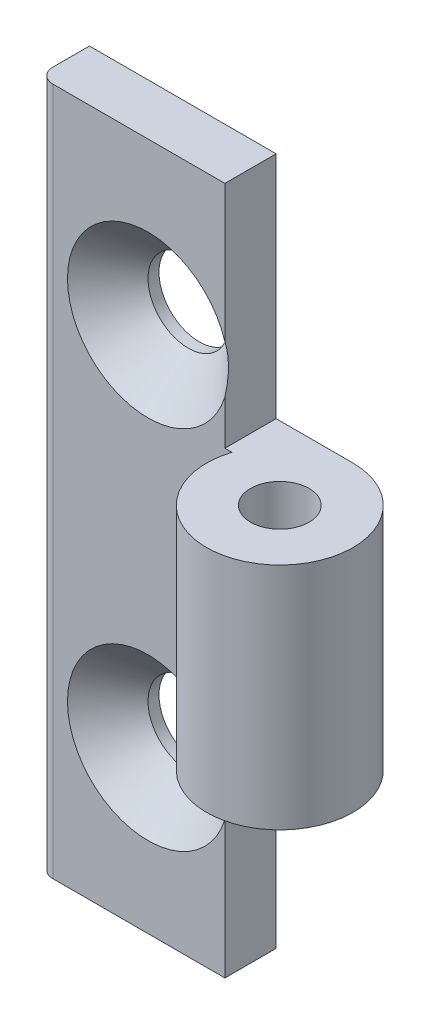
ISO-10303-21;
HEADER;
FILE_DESCRIPTION(('STEP AP214'),'2;1');
FILE_NAME('part.step','',(''),(''),'','','');
FILE_SCHEMA(('AUTOMOTIVE_DESIGN { 1 0 10303 214 1 1 1 1 }'));
ENDSEC;
DATA;
#1=APPLICATION_CONTEXT('core data for automotive mechanical design processes');
#2=APPLICATION_PROTOCOL_DEFINITION('international standard','automotive_design',2000,#1);
#3=PRODUCT_CONTEXT('',#1,'mechanical');
#4=PRODUCT('Part','Part','',(#3));
#5=PRODUCT_RELATED_PRODUCT_CATEGORY('part','',(#4));
#6=PRODUCT_DEFINITION_FORMATION('','',#4);
#7=PRODUCT_DEFINITION_CONTEXT('part definition',#1,'design');
#8=PRODUCT_DEFINITION('design','',#6,#7);
#9=PRODUCT_DEFINITION_SHAPE('','',#8);
#10=(LENGTH_UNIT() NAMED_UNIT(*) SI_UNIT(.MILLI.,.METRE.));
#11=(NAMED_UNIT(*) PLANE_ANGLE_UNIT() SI_UNIT($,.RADIAN.));
#12=(NAMED_UNIT(*) SI_UNIT($,.STERADIAN.) SOLID_ANGLE_UNIT());
#13=UNCERTAINTY_MEASURE_WITH_UNIT(LENGTH_MEASURE(1.E-05),#10,'distance_accuracy_value','');
#14=(GEOMETRIC_REPRESENTATION_CONTEXT(3) GLOBAL_UNCERTAINTY_ASSIGNED_CONTEXT((#13)) GLOBAL_UNIT_ASSIGNED_CONTEXT((#10,
#11,#12)) REPRESENTATION_CONTEXT('',''));
#15=CARTESIAN_POINT('',(0.,0.,0.));
#16=DIRECTION('',(0.,0.,1.));
#17=DIRECTION('',(1.,0.,0.));
#18=AXIS2_PLACEMENT_3D('',#15,#16,#17);
#19=CARTESIAN_POINT('',(0.,23.5,0.));
#20=DIRECTION('',(0.,-1.,0.));
#21=DIRECTION('',(0.,0.,-1.));
#22=AXIS2_PLACEMENT_3D('',#19,#20,#21);
#23=PLANE('',#22);
#24=CARTESIAN_POINT('',(-17.0000000000007,23.5,-2.49999999999931));
#25=DIRECTION('',(0.,-1.,0.));
#26=DIRECTION('',(0.,0.,-1.));
#27=AXIS2_PLACEMENT_3D('',#24,#25,#26);
#28=CIRCLE('',#27,0.999999999999304);
#29=CARTESIAN_POINT('',(-17.,23.5,-1.5));
#30=VERTEX_POINT('',#29);
#31=CARTESIAN_POINT('',(-18.,23.5,-2.5));
#32=VERTEX_POINT('',#31);
#33=EDGE_CURVE('E52',#30,#32,#28,.T.);
#34=ORIENTED_EDGE('',*,*,#33,.F.);
#35=DIRECTION('',(-1.,0.,0.));
#36=VECTOR('',#35,1.);
#37=CARTESIAN_POINT('',(0.,23.5,-1.5));
#38=LINE('',#37,#36);
#39=CARTESIAN_POINT('',(-5.25,23.5,-1.5));
#40=VERTEX_POINT('',#39);
#41=EDGE_CURVE('E134',#40,#30,#38,.T.);
#42=ORIENTED_EDGE('',*,*,#41,.F.);
#43=DIRECTION('',(0.,0.,-1.));
#44=VECTOR('',#43,1.);
#45=CARTESIAN_POINT('',(-5.25,23.5,47.));
#46=LINE('',#45,#44);
#47=CARTESIAN_POINT('',(-5.25,23.5,-5.));
#48=VERTEX_POINT('',#47);
#49=EDGE_CURVE('E249',#40,#48,#46,.T.);
#50=ORIENTED_EDGE('',*,*,#49,.T.);
#51=DIRECTION('',(-1.,0.,0.));
#52=VECTOR('',#51,1.);
#53=CARTESIAN_POINT('',(0.,23.5,-5.));
#54=LINE('',#53,#52);
#55=CARTESIAN_POINT('',(-18.,23.5,-5.));
#56=VERTEX_POINT('',#55);
#57=EDGE_CURVE('E140',#48,#56,#54,.T.);
#58=ORIENTED_EDGE('',*,*,#57,.T.);
#59=DIRECTION('',(0.,0.,-1.));
#60=VECTOR('',#59,1.);
#61=CARTESIAN_POINT('',(-18.,23.5,-1.5));
#62=LINE('',#61,#60);
#63=EDGE_CURVE('E142',#32,#56,#62,.T.);
#64=ORIENTED_EDGE('',*,*,#63,.F.);
#65=EDGE_LOOP('',(#34,#42,#50,#58,#64));
#66=FACE_BOUND('',#65,.T.);
#67=ADVANCED_FACE('F33',(#66),#23,.F.);
#68=CARTESIAN_POINT('',(5.,-23.5,0.));
#69=DIRECTION('',(0.,1.,0.));
#70=DIRECTION('',(0.,0.,1.));
#71=AXIS2_PLACEMENT_3D('',#68,#69,#70);
#72=PLANE('',#71);
#73=CARTESIAN_POINT('',(-17.0000000000007,-23.5,-2.49999999999931));
#74=DIRECTION('',(0.,-1.,0.));
#75=DIRECTION('',(0.,0.,-1.));
#76=AXIS2_PLACEMENT_3D('',#73,#74,#75);
#77=CIRCLE('',#76,0.999999999999304);
#78=CARTESIAN_POINT('',(-17.,-23.5,-1.5));
#79=VERTEX_POINT('',#78);
#80=CARTESIAN_POINT('',(-18.,-23.5,-2.5));
#81=VERTEX_POINT('',#80);
#82=EDGE_CURVE('E117',#79,#81,#77,.T.);
#83=ORIENTED_EDGE('',*,*,#82,.T.);
#84=DIRECTION('',(0.,0.,-1.));
#85=VECTOR('',#84,1.);
#86=CARTESIAN_POINT('',(-18.,-23.5,-1.5));
#87=LINE('',#86,#85);
#88=CARTESIAN_POINT('',(-18.,-23.5,-5.));
#89=VERTEX_POINT('',#88);
#90=EDGE_CURVE('E159',#81,#89,#87,.T.);
#91=ORIENTED_EDGE('',*,*,#90,.T.);
#92=DIRECTION('',(1.,0.,0.));
#93=VECTOR('',#92,1.);
#94=CARTESIAN_POINT('',(-18.,-23.5,-5.));
#95=LINE('',#94,#93);
#96=CARTESIAN_POINT('',(-5.25,-23.5,-5.));
#97=VERTEX_POINT('',#96);
#98=EDGE_CURVE('E154',#89,#97,#95,.T.);
#99=ORIENTED_EDGE('',*,*,#98,.T.);
#100=DIRECTION('',(0.,0.,-1.));
#101=VECTOR('',#100,1.);
#102=CARTESIAN_POINT('',(-5.25,-23.5,47.));
#103=LINE('',#102,#101);
#104=CARTESIAN_POINT('',(-5.25,-23.5,-1.5));
#105=VERTEX_POINT('',#104);
#106=EDGE_CURVE('E139',#105,#97,#103,.T.);
#107=ORIENTED_EDGE('',*,*,#106,.F.);
#108=DIRECTION('',(1.,0.,0.));
#109=VECTOR('',#108,1.);
#110=CARTESIAN_POINT('',(-18.,-23.5,-1.5));
#111=LINE('',#110,#109);
#112=EDGE_CURVE('E130',#79,#105,#111,.T.);
#113=ORIENTED_EDGE('',*,*,#112,.F.);
#114=EDGE_LOOP('',(#83,#91,#99,#107,#113));
#115=FACE_BOUND('',#114,.T.);
#116=ADVANCED_FACE('F137',(#115),#72,.F.);
#117=CARTESIAN_POINT('',(0.,0.,-1.5));
#118=DIRECTION('',(0.,0.,1.));
#119=DIRECTION('',(1.,0.,0.));
#120=AXIS2_PLACEMENT_3D('',#117,#118,#119);
#121=PLANE('',#120);
#122=ORIENTED_EDGE('',*,*,#41,.T.);
#123=DIRECTION('',(0.,-1.,0.));
#124=VECTOR('',#123,1.);
#125=CARTESIAN_POINT('',(-17.,23.5,-1.5));
#126=LINE('',#125,#124);
#127=EDGE_CURVE('E120',#30,#79,#126,.T.);
#128=ORIENTED_EDGE('',*,*,#127,.T.);
#129=ORIENTED_EDGE('',*,*,#112,.T.);
#130=DIRECTION('',(0.,-1.,0.));
#131=VECTOR('',#130,1.);
#132=CARTESIAN_POINT('',(-5.25,0.,-1.5));
#133=LINE('',#132,#131);
#134=CARTESIAN_POINT('',(-5.25,-14.1393596310755,-1.5));
#135=VERTEX_POINT('',#134);
#136=EDGE_CURVE('E267',#135,#105,#133,.T.);
#137=ORIENTED_EDGE('',*,*,#136,.F.);
#138=CARTESIAN_POINT('',(-10.5,-12.5,-1.5));
#139=DIRECTION('',(0.,0.,-1.));
#140=DIRECTION('',(-1.,0.,0.));
#141=AXIS2_PLACEMENT_3D('',#138,#139,#140);
#142=CIRCLE('',#141,5.5);
#143=CARTESIAN_POINT('',(-5.25,-10.8606403689245,-1.5));
#144=VERTEX_POINT('',#143);
#145=EDGE_CURVE('E239',#135,#144,#142,.T.);
#146=ORIENTED_EDGE('',*,*,#145,.T.);
#147=CARTESIAN_POINT('',(-5.25,-7.8333333333333,-1.5));
#148=VERTEX_POINT('',#147);
#149=EDGE_CURVE('E148',#148,#144,#133,.T.);
#150=ORIENTED_EDGE('',*,*,#149,.F.);
#151=DIRECTION('',(-1.,0.,0.));
#152=VECTOR('',#151,1.);
#153=CARTESIAN_POINT('',(0.,-7.8333333333333,-1.5));
#154=LINE('',#153,#152);
#155=CARTESIAN_POINT('',(-4.76969600708473,-7.8333333333333,-1.5));
#156=VERTEX_POINT('',#155);
#157=EDGE_CURVE('E266',#156,#148,#154,.T.);
#158=ORIENTED_EDGE('',*,*,#157,.F.);
#159=DIRECTION('',(0.,1.,0.));
#160=VECTOR('',#159,1.);
#161=CARTESIAN_POINT('',(-4.76969600708473,-23.5,-1.5));
#162=LINE('',#161,#160);
#163=CARTESIAN_POINT('',(-4.76969600708473,7.8333333333333,-1.5));
#164=VERTEX_POINT('',#163);
#165=EDGE_CURVE('E161',#164,#156,#162,.F.);
#166=ORIENTED_EDGE('',*,*,#165,.F.);
#167=DIRECTION('',(1.,0.,0.));
#168=VECTOR('',#167,1.);
#169=CARTESIAN_POINT('',(0.,7.8333333333333,-1.5));
#170=LINE('',#169,#168);
#171=CARTESIAN_POINT('',(-5.25,7.8333333333333,-1.5));
#172=VERTEX_POINT('',#171);
#173=EDGE_CURVE('E262',#172,#164,#170,.T.);
#174=ORIENTED_EDGE('',*,*,#173,.F.);
#175=DIRECTION('',(0.,-1.,0.));
#176=VECTOR('',#175,1.);
#177=CARTESIAN_POINT('',(-5.25,0.,-1.5));
#178=LINE('',#177,#176);
#179=CARTESIAN_POINT('',(-5.25,10.8606403689245,-1.5));
#180=VERTEX_POINT('',#179);
#181=EDGE_CURVE('E256',#180,#172,#178,.T.);
#182=ORIENTED_EDGE('',*,*,#181,.F.);
#183=CARTESIAN_POINT('',(-10.5,12.5,-1.5));
#184=DIRECTION('',(0.,0.,-1.));
#185=DIRECTION('',(-1.,0.,0.));
#186=AXIS2_PLACEMENT_3D('',#183,#184,#185);
#187=CIRCLE('',#186,5.5);
#188=CARTESIAN_POINT('',(-5.25,14.1393596310755,-1.5));
#189=VERTEX_POINT('',#188);
#190=EDGE_CURVE('E58',#180,#189,#187,.T.);
#191=ORIENTED_EDGE('',*,*,#190,.T.);
#192=EDGE_CURVE('E257',#40,#189,#178,.T.);
#193=ORIENTED_EDGE('',*,*,#192,.F.);
#194=EDGE_LOOP('',(#122,#128,#129,#137,#146,#150,#158,#166,#174,#182,#191,#193));
#195=FACE_BOUND('',#194,.T.);
#196=ADVANCED_FACE('F128',(#195),#121,.T.);
#197=CARTESIAN_POINT('',(-18.,23.5,-1.5));
#198=DIRECTION('',(1.,0.,0.));
#199=DIRECTION('',(0.,0.,-1.));
#200=AXIS2_PLACEMENT_3D('',#197,#198,#199);
#201=PLANE('',#200);
#202=DIRECTION('',(0.,-1.,0.));
#203=VECTOR('',#202,1.);
#204=CARTESIAN_POINT('',(-18.,23.5,-2.5));
#205=LINE('',#204,#203);
#206=EDGE_CURVE('E121',#32,#81,#205,.T.);
#207=ORIENTED_EDGE('',*,*,#206,.F.);
#208=ORIENTED_EDGE('',*,*,#63,.T.);
#209=DIRECTION('',(0.,-1.,0.));
#210=VECTOR('',#209,1.);
#211=CARTESIAN_POINT('',(-18.,23.5,-5.));
#212=LINE('',#211,#210);
#213=EDGE_CURVE('E151',#56,#89,#212,.T.);
#214=ORIENTED_EDGE('',*,*,#213,.T.);
#215=ORIENTED_EDGE('',*,*,#90,.F.);
#216=EDGE_LOOP('',(#207,#208,#214,#215));
#217=FACE_BOUND('',#216,.T.);
#218=ADVANCED_FACE('F209',(#217),#201,.F.);
#219=CARTESIAN_POINT('',(-5.25,7.8333333333333,47.));
#220=DIRECTION('',(-1.,0.,0.));
#221=DIRECTION('',(0.,0.,1.));
#222=AXIS2_PLACEMENT_3D('',#219,#220,#221);
#223=PLANE('',#222);
#224=CARTESIAN_POINT('',(-5.25,1.96620570453176,4.76959312207688));
#225=CARTESIAN_POINT('',(-5.25,2.17789575709252,4.58014854863097));
#226=CARTESIAN_POINT('',(-5.25,2.39013508266683,4.39131375979838));
#227=CARTESIAN_POINT('',(-5.25,2.81595003155766,4.01513768812596));
#228=CARTESIAN_POINT('',(-5.25,3.02952571599067,3.82779647449701));
#229=CARTESIAN_POINT('',(-5.25,3.45858131899658,3.45459486651712));
#230=CARTESIAN_POINT('',(-5.25,3.67406377545094,3.26873738612356));
#231=CARTESIAN_POINT('',(-5.25,4.10688472778992,2.89920089340847));
#232=CARTESIAN_POINT('',(-5.25,4.32422319348273,2.71552184576592));
#233=CARTESIAN_POINT('',(-5.25,4.76923849679367,2.3440673477564));
#234=CARTESIAN_POINT('',(-5.25,4.99699970912213,2.15639279130553));
#235=CARTESIAN_POINT('',(-5.25,5.45544950022572,1.7846560633459));
#236=CARTESIAN_POINT('',(-5.25,5.68613801140881,1.60059380867722));
#237=CARTESIAN_POINT('',(-5.25,6.1509780017392,1.23720637031563));
#238=CARTESIAN_POINT('',(-5.25,6.38512704848103,1.05787808510293));
#239=CARTESIAN_POINT('',(-5.25,6.85790780293076,0.705250712790699));
#240=CARTESIAN_POINT('',(-5.25,7.09653907927989,0.531951050043126));
#241=CARTESIAN_POINT('',(-5.25,7.58062314874416,0.192551610200415));
#242=CARTESIAN_POINT('',(-5.25,7.82610332043215,0.026490646830292));
#243=CARTESIAN_POINT('',(-5.25,8.32440406810655,-0.294647382925031));
#244=CARTESIAN_POINT('',(-5.25,8.5772283873505,-0.44971870439318));
#245=CARTESIAN_POINT('',(-5.25,9.08959522887237,-0.743038287158069));
#246=CARTESIAN_POINT('',(-5.25,9.34905909165822,-0.88142253292033));
#247=CARTESIAN_POINT('',(-5.25,9.87841128399093,-1.13641998213882));
#248=CARTESIAN_POINT('',(-5.25,10.1482860258345,-1.25306047658699));
#249=CARTESIAN_POINT('',(-5.25,10.5291281452276,-1.39310419344067));
#250=CARTESIAN_POINT('',(-5.25,10.6353055224393,-1.42960265943194));
#251=CARTESIAN_POINT('',(-5.25,10.8492565825674,-1.49753395320315));
#252=CARTESIAN_POINT('',(-5.25,10.9570302094983,-1.52896695818745));
#253=CARTESIAN_POINT('',(-5.25,11.2827306764191,-1.6147850213403));
#254=CARTESIAN_POINT('',(-5.25,11.5030328211093,-1.66068750629753));
#255=CARTESIAN_POINT('',(-5.25,11.8553645226943,-1.71214567567516));
#256=CARTESIAN_POINT('',(-5.25,11.9861522961667,-1.72653811787084));
#257=CARTESIAN_POINT('',(-5.25,12.248456971617,-1.74560250939123));
#258=CARTESIAN_POINT('',(-5.25,12.3799738643842,-1.75027458123124));
#259=CARTESIAN_POINT('',(-5.25,12.6428127837559,-1.74970069437844));
#260=CARTESIAN_POINT('',(-5.25,12.7741348419126,-1.74446758814681));
#261=CARTESIAN_POINT('',(-5.25,13.0360362643994,-1.72432273692963));
#262=CARTESIAN_POINT('',(-5.25,13.1666155317276,-1.70940975583893));
#263=CARTESIAN_POINT('',(-5.25,13.4880704237974,-1.66118269237422));
#264=CARTESIAN_POINT('',(-5.25,13.6781491880637,-1.62249444652424));
#265=CARTESIAN_POINT('',(-5.25,14.0540045718539,-1.52786666411824));
#266=CARTESIAN_POINT('',(-5.25,14.2397781681888,-1.47191537747716));
#267=CARTESIAN_POINT('',(-5.25,14.5158903644421,-1.37694825665352));
#268=CARTESIAN_POINT('',(-5.25,14.6080905731277,-1.34319772624565));
#269=CARTESIAN_POINT('',(-5.25,14.7911885454548,-1.2724420914636));
#270=CARTESIAN_POINT('',(-5.25,14.8820868892192,-1.23543849270507));
#271=CARTESIAN_POINT('',(-5.25,15.0626190202741,-1.15852357302256));
#272=CARTESIAN_POINT('',(-5.25,15.1522530429236,-1.11861280204142));
#273=CARTESIAN_POINT('',(-5.25,15.3303269744517,-1.03619054925571));
#274=CARTESIAN_POINT('',(-5.25,15.4187667326326,-0.993678742915533));
#275=CARTESIAN_POINT('',(-5.25,15.6569744419579,-0.875299949092434));
#276=CARTESIAN_POINT('',(-5.25,15.8056387148912,-0.797207983332616));
#277=CARTESIAN_POINT('',(-5.25,16.0999407992361,-0.635492051003212));
#278=CARTESIAN_POINT('',(-5.25,16.2455780151388,-0.551867009205114));
#279=CARTESIAN_POINT('',(-5.25,16.5342319097201,-0.380025153128538));
#280=CARTESIAN_POINT('',(-5.25,16.6772469003954,-0.291805512422881));
#281=CARTESIAN_POINT('',(-5.25,16.9608892510794,-0.11159946622438));
#282=CARTESIAN_POINT('',(-5.25,17.1015164232778,-0.0196127663628434));
#283=CARTESIAN_POINT('',(-5.25,17.5214120667191,0.261792066141473));
#284=CARTESIAN_POINT('',(-5.25,17.7975127388819,0.455937253399674));
#285=CARTESIAN_POINT('',(-5.25,18.3431157983201,0.853001446314746));
#286=CARTESIAN_POINT('',(-5.25,18.6126204306579,1.05591739978734));
#287=CARTESIAN_POINT('',(-5.25,19.1249670633103,1.45153362750591));
#288=CARTESIAN_POINT('',(-5.25,19.3682000190748,1.64372937671005));
#289=CARTESIAN_POINT('',(-5.25,19.851291097354,2.03235411497323));
#290=CARTESIAN_POINT('',(-5.25,20.0911488748326,2.22878353170724));
#291=CARTESIAN_POINT('',(-5.25,20.5658606167883,2.62305843405526));
#292=CARTESIAN_POINT('',(-5.25,20.8007404616427,2.82087283826274));
#293=CARTESIAN_POINT('',(-5.25,21.2682251547819,3.21907693847443));
#294=CARTESIAN_POINT('',(-5.25,21.5008304625402,3.41946609460877));
#295=CARTESIAN_POINT('',(-5.25,21.7325548409188,3.62085537471317));
#296=B_SPLINE_CURVE_WITH_KNOTS('',3,(#224,#225,#226,#227,#228,#229,#230,#231,#232,#233,#234,
#235,#236,#237,#238,#239,#240,#241,#242,#243,#244,#245,#246,#247,#248,#249,#250,#251,#252,#253,
#254,#255,#256,#257,#258,#259,#260,#261,#262,#263,#264,#265,#266,#267,#268,#269,#270,#271,#272,
#273,#274,#275,#276,#277,#278,#279,#280,#281,#282,#283,#284,#285,#286,#287,#288,#289,#290,#291,
#292,#293,#294,#295),.UNSPECIFIED.,.F.,.F.,(4,2,2,2,2,2,2,2,2,2,2,2,2,2,2,2,2,2,2,2,2,2,2,2,2,2,
2,2,2,2,2,2,2,2,2,4),(0.,0.852245300289658,1.70452986592093,2.5582046638551,3.41186560136745,
4.29720208563532,5.18251816433036,6.06723904881684,6.95187522180661,7.84078372762304,
8.73015354063419,9.61170003799586,10.4921325284726,10.8288455957403,11.1655468812608,
11.8389631295675,12.2333868317742,12.6278055626448,13.0217128664047,13.4156704814209,
13.9966075832166,14.5779409753054,14.8724402859559,15.1668040041266,15.4611121821052,
15.7554571565992,16.2590808068384,16.7628026140554,17.2668380390615,17.7709129262641,
18.7832066996735,19.7951509920857,20.7250981703801,21.6551397341398,22.5763638012946,
23.4973977615846),.UNSPECIFIED.);
#297=EDGE_CURVE('E11',#180,#189,#296,.T.);
#298=ORIENTED_EDGE('',*,*,#297,.F.);
#299=ORIENTED_EDGE('',*,*,#181,.T.);
#300=DIRECTION('',(0.,0.,-1.));
#301=VECTOR('',#300,1.);
#302=CARTESIAN_POINT('',(-5.25,7.8333333333333,47.));
#303=LINE('',#302,#301);
#304=CARTESIAN_POINT('',(-5.25,7.8333333333333,-5.));
#305=VERTEX_POINT('',#304);
#306=EDGE_CURVE('E251',#172,#305,#303,.T.);
#307=ORIENTED_EDGE('',*,*,#306,.T.);
#308=DIRECTION('',(0.,-1.,0.));
#309=VECTOR('',#308,1.);
#310=CARTESIAN_POINT('',(-5.25,0.,-5.));
#311=LINE('',#310,#309);
#312=EDGE_CURVE('E164',#48,#305,#311,.T.);
#313=ORIENTED_EDGE('',*,*,#312,.F.);
#314=ORIENTED_EDGE('',*,*,#49,.F.);
#315=ORIENTED_EDGE('',*,*,#192,.T.);
#316=EDGE_LOOP('',(#298,#299,#307,#313,#314,#315));
#317=FACE_BOUND('',#316,.T.);
#318=ADVANCED_FACE('F205',(#317),#223,.F.);
#319=CARTESIAN_POINT('',(-5.25,-23.5,47.));
#320=DIRECTION('',(-1.,0.,0.));
#321=DIRECTION('',(0.,0.,1.));
#322=AXIS2_PLACEMENT_3D('',#319,#320,#321);
#323=PLANE('',#322);
#324=CARTESIAN_POINT('',(-5.25,-26.6003505571546,8.04600896698692));
#325=CARTESIAN_POINT('',(-5.25,-26.2776648085903,7.74363522228391));
#326=CARTESIAN_POINT('',(-5.25,-25.9543760333835,7.44190112679981));
#327=CARTESIAN_POINT('',(-5.25,-25.3062442856165,6.84007510363304));
#328=CARTESIAN_POINT('',(-5.25,-24.981401236746,6.53998325816311));
#329=CARTESIAN_POINT('',(-5.25,-24.3290085549213,5.94106702983706));
#330=CARTESIAN_POINT('',(-5.25,-24.0014541149649,5.64224787733475));
#331=CARTESIAN_POINT('',(-5.25,-23.3440030064451,5.04721250482845));
#332=CARTESIAN_POINT('',(-5.25,-23.0141064029779,4.75099621299057));
#333=CARTESIAN_POINT('',(-5.25,-22.3175857857699,4.13191138221224));
#334=CARTESIAN_POINT('',(-5.25,-21.9506430464078,3.80940087226669));
#335=CARTESIAN_POINT('',(-5.25,-21.2119337622045,3.16985546104611));
#336=CARTESIAN_POINT('',(-5.25,-20.8401667728391,2.85282107072594));
#337=CARTESIAN_POINT('',(-5.25,-20.2778680945298,2.38334730243548));
#338=CARTESIAN_POINT('',(-5.25,-20.0897884556362,2.22797139643917));
#339=CARTESIAN_POINT('',(-5.25,-19.7116976837063,1.91959020102894));
#340=CARTESIAN_POINT('',(-5.25,-19.5216865856777,1.76658486877479));
#341=CARTESIAN_POINT('',(-5.25,-19.1394011943411,1.46348533805961));
#342=CARTESIAN_POINT('',(-5.25,-18.9471272613402,1.31339068594978));
#343=CARTESIAN_POINT('',(-5.25,-18.5598462151183,1.01677727218896));
#344=CARTESIAN_POINT('',(-5.25,-18.3648392296139,0.870258344314297));
#345=CARTESIAN_POINT('',(-5.25,-18.005953626149,0.606962908761055));
#346=CARTESIAN_POINT('',(-5.25,-17.8426016540454,0.489469792530127));
#347=CARTESIAN_POINT('',(-5.25,-17.5132682084315,0.258209367499158));
#348=CARTESIAN_POINT('',(-5.25,-17.3472866765122,0.14444214163275));
#349=CARTESIAN_POINT('',(-5.25,-17.0119715101354,-0.0786782537960856));
#350=CARTESIAN_POINT('',(-5.25,-16.8426327726815,-0.188023789567103));
#351=CARTESIAN_POINT('',(-5.25,-16.5003671379625,-0.400949124177243));
#352=CARTESIAN_POINT('',(-5.25,-16.3274403782963,-0.504529143562064));
#353=CARTESIAN_POINT('',(-5.25,-15.9811439048985,-0.702293218462214));
#354=CARTESIAN_POINT('',(-5.25,-15.8078633323571,-0.796631207701722));
#355=CARTESIAN_POINT('',(-5.25,-15.4568179862008,-0.976503617572549));
#356=CARTESIAN_POINT('',(-5.25,-15.2790522782892,-1.06203618478084));
#357=CARTESIAN_POINT('',(-5.25,-14.7392208755938,-1.30149220508657));
#358=CARTESIAN_POINT('',(-5.25,-14.3692297912383,-1.43910953227761));
#359=CARTESIAN_POINT('',(-5.25,-13.8597949348459,-1.57820816482983));
#360=CARTESIAN_POINT('',(-5.25,-13.7284013393436,-1.60976102753559));
#361=CARTESIAN_POINT('',(-5.25,-13.4637258245985,-1.66384994805054));
#362=CARTESIAN_POINT('',(-5.25,-13.3304437616567,-1.68638531583503));
#363=CARTESIAN_POINT('',(-5.25,-13.0628199298205,-1.72158071391647));
#364=CARTESIAN_POINT('',(-5.25,-12.9284805579778,-1.73425881296761));
#365=CARTESIAN_POINT('',(-5.25,-12.6592180337848,-1.74930692277106));
#366=CARTESIAN_POINT('',(-5.25,-12.5242948624115,-1.75167659505415));
#367=CARTESIAN_POINT('',(-5.25,-12.2314809296486,-1.74550870205161));
#368=CARTESIAN_POINT('',(-5.25,-12.0736282152239,-1.73502653590481));
#369=CARTESIAN_POINT('',(-5.25,-11.7594450567878,-1.7003287479165));
#370=CARTESIAN_POINT('',(-5.25,-11.6031148628184,-1.67611090771464));
#371=CARTESIAN_POINT('',(-5.25,-11.292366667522,-1.61506107260624));
#372=CARTESIAN_POINT('',(-5.25,-11.1379579245366,-1.57818256249691));
#373=CARTESIAN_POINT('',(-5.25,-10.832225074166,-1.49342363712409));
#374=CARTESIAN_POINT('',(-5.25,-10.6809010757812,-1.44554283382248));
#375=CARTESIAN_POINT('',(-5.25,-10.359046393724,-1.33253363490235));
#376=CARTESIAN_POINT('',(-5.25,-10.1890501341022,-1.26589425807713));
#377=CARTESIAN_POINT('',(-5.25,-9.85331795346919,-1.12255484792298));
#378=CARTESIAN_POINT('',(-5.25,-9.68758393214744,-1.04585041843245));
#379=CARTESIAN_POINT('',(-5.25,-9.35985848493816,-0.884230703569723));
#380=CARTESIAN_POINT('',(-5.25,-9.19787370343333,-0.799302045932223));
#381=CARTESIAN_POINT('',(-5.25,-8.87753480931902,-0.622941108605644));
#382=CARTESIAN_POINT('',(-5.25,-8.71918022728835,-0.531509676135073));
#383=CARTESIAN_POINT('',(-5.25,-8.40338702758905,-0.342030653883525));
#384=CARTESIAN_POINT('',(-5.25,-8.24599439295884,-0.243906782129586));
#385=CARTESIAN_POINT('',(-5.25,-7.93404274553729,-0.0432618226003899));
#386=CARTESIAN_POINT('',(-5.25,-7.7794838069841,0.059259380143335));
#387=CARTESIAN_POINT('',(-5.25,-7.47297751067142,0.267795807347991));
#388=CARTESIAN_POINT('',(-5.25,-7.3210276665822,0.37380738812394));
#389=CARTESIAN_POINT('',(-5.25,-7.01925649753526,0.588797387929581));
#390=CARTESIAN_POINT('',(-5.25,-6.86943508444105,0.697775683562009));
#391=CARTESIAN_POINT('',(-5.25,-6.5404934622026,0.941256011053461));
#392=CARTESIAN_POINT('',(-5.25,-6.36179733401846,1.07633031139282));
#393=CARTESIAN_POINT('',(-5.25,-6.00667117421934,1.34942957450511));
#394=CARTESIAN_POINT('',(-5.25,-5.83024122122249,1.48745463920572));
#395=CARTESIAN_POINT('',(-5.25,-5.3037750997341,1.90518380488842));
#396=CARTESIAN_POINT('',(-5.25,-4.95661030947537,2.18850616488069));
#397=CARTESIAN_POINT('',(-5.25,-4.26771793848706,2.76200357521821));
#398=CARTESIAN_POINT('',(-5.25,-3.92599329497658,3.05218213043985));
#399=CARTESIAN_POINT('',(-5.25,-3.24676165433352,3.6374448862089));
#400=CARTESIAN_POINT('',(-5.25,-2.90925478076536,3.93252922988963));
#401=CARTESIAN_POINT('',(-5.25,-2.23668935242119,4.52706859409326));
#402=CARTESIAN_POINT('',(-5.25,-1.90163852647138,4.82653233807233));
#403=CARTESIAN_POINT('',(-5.25,-1.23408490649624,5.42829377550018));
#404=CARTESIAN_POINT('',(-5.25,-0.901582154159578,5.73059151513642));
#405=CARTESIAN_POINT('',(-5.25,-0.238718987208984,6.33730501712813));
#406=CARTESIAN_POINT('',(-5.25,0.0916421000755467,6.64172004531475));
#407=CARTESIAN_POINT('',(-5.25,0.750720440733688,7.25232415215834));
#408=CARTESIAN_POINT('',(-5.25,1.07943769115545,7.55851323399884));
#409=CARTESIAN_POINT('',(-5.25,1.9816839949167,8.40260882622122));
#410=CARTESIAN_POINT('',(-5.25,2.5538311819439,8.94199205906421));
#411=CARTESIAN_POINT('',(-5.25,3.69521057757047,10.0239390046083));
#412=CARTESIAN_POINT('',(-5.25,4.26444249874157,10.5665030200211));
#413=CARTESIAN_POINT('',(-5.25,5.39826451507161,11.651631361637));
#414=CARTESIAN_POINT('',(-5.25,5.96286405364642,12.1941858277097));
#415=CARTESIAN_POINT('',(-5.25,7.09028073762804,13.2810194068588));
#416=CARTESIAN_POINT('',(-5.25,7.6530980733399,13.8252983224649));
#417=CARTESIAN_POINT('',(-5.25,8.21529610047225,14.3702127394708));
#418=B_SPLINE_CURVE_WITH_KNOTS('',3,(#324,#325,#326,#327,#328,#329,#330,#331,#332,#333,#334,
#335,#336,#337,#338,#339,#340,#341,#342,#343,#344,#345,#346,#347,#348,#349,#350,#351,#352,#353,
#354,#355,#356,#357,#358,#359,#360,#361,#362,#363,#364,#365,#366,#367,#368,#369,#370,#371,#372,
#373,#374,#375,#376,#377,#378,#379,#380,#381,#382,#383,#384,#385,#386,#387,#388,#389,#390,#391,
#392,#393,#394,#395,#396,#397,#398,#399,#400,#401,#402,#403,#404,#405,#406,#407,#408,#409,#410,
#411,#412,#413,#414,#415,#416,#417),.UNSPECIFIED.,.F.,.F.,(4,2,2,2,2,2,2,2,2,2,2,2,2,2,2,2,2,2,
2,2,2,2,2,2,2,2,2,2,2,2,2,2,2,2,2,2,2,2,2,2,2,2,2,2,2,2,4),(0.,1.32665444243336,
2.65337470192894,3.98350033358125,5.31358914032394,6.77913894789077,8.24482476932668,
8.97668467463452,9.70853133854583,10.4402630073848,11.1719605953761,11.7755712790736,
12.3791953892665,12.9838206287376,13.5884227238352,14.1800502763959,14.7718021050844,
15.9504570331893,16.3555966216295,16.7607672056938,17.1651933339042,17.5696327410326,
18.0435823032895,18.5176084318968,18.993395104532,19.4691985601879,20.0165653232128,
20.5641719630369,21.112684437234,21.6611255785553,22.2174599396817,22.7738088550782,
23.3295943337727,23.8853567303922,24.5573264788459,25.2293194766475,26.5734840229253,
27.9183512425603,29.2632577697,30.6113618746794,31.9594879889152,33.3071678831243,
34.6548501964977,37.0137677366885,39.3729135399549,41.7220029687451,44.070832476652),.UNSPECIFIED.);
#419=EDGE_CURVE('E45',#135,#144,#418,.T.);
#420=ORIENTED_EDGE('',*,*,#419,.F.);
#421=ORIENTED_EDGE('',*,*,#136,.T.);
#422=ORIENTED_EDGE('',*,*,#106,.T.);
#423=DIRECTION('',(0.,-1.,0.));
#424=VECTOR('',#423,1.);
#425=CARTESIAN_POINT('',(-5.25,0.,-5.));
#426=LINE('',#425,#424);
#427=CARTESIAN_POINT('',(-5.25,-7.8333333333333,-5.));
#428=VERTEX_POINT('',#427);
#429=EDGE_CURVE('E173',#428,#97,#426,.T.);
#430=ORIENTED_EDGE('',*,*,#429,.F.);
#431=DIRECTION('',(0.,0.,-1.));
#432=VECTOR('',#431,1.);
#433=CARTESIAN_POINT('',(-5.25,-7.8333333333333,47.));
#434=LINE('',#433,#432);
#435=EDGE_CURVE('E253',#148,#428,#434,.T.);
#436=ORIENTED_EDGE('',*,*,#435,.F.);
#437=ORIENTED_EDGE('',*,*,#149,.T.);
#438=EDGE_LOOP('',(#420,#421,#422,#430,#436,#437));
#439=FACE_BOUND('',#438,.T.);
#440=ADVANCED_FACE('F185',(#439),#323,.F.);
#441=CARTESIAN_POINT('',(0.,-23.5,0.));
#442=DIRECTION('',(0.,1.,0.));
#443=DIRECTION('',(0.,0.,1.));
#444=AXIS2_PLACEMENT_3D('',#441,#442,#443);
#445=CYLINDRICAL_SURFACE('',#444,5.);
#446=ORIENTED_EDGE('',*,*,#165,.T.);
#447=CARTESIAN_POINT('',(0.,-7.8333333333333,0.));
#448=DIRECTION('',(0.,1.,0.));
#449=DIRECTION('',(0.,0.,1.));
#450=AXIS2_PLACEMENT_3D('',#447,#448,#449);
#451=CIRCLE('',#450,5.);
#452=CARTESIAN_POINT('',(0.,-7.8333333333333,-5.));
#453=VERTEX_POINT('',#452);
#454=EDGE_CURVE('E265',#156,#453,#451,.T.);
#455=ORIENTED_EDGE('',*,*,#454,.T.);
#456=DIRECTION('',(0.,1.,0.));
#457=VECTOR('',#456,1.);
#458=CARTESIAN_POINT('',(0.,-23.5,-5.));
#459=LINE('',#458,#457);
#460=CARTESIAN_POINT('',(0.,7.8333333333333,-5.));
#461=VERTEX_POINT('',#460);
#462=EDGE_CURVE('E145',#453,#461,#459,.T.);
#463=ORIENTED_EDGE('',*,*,#462,.T.);
#464=CARTESIAN_POINT('',(0.,7.8333333333333,0.));
#465=DIRECTION('',(0.,-1.,0.));
#466=DIRECTION('',(0.,0.,-1.));
#467=AXIS2_PLACEMENT_3D('',#464,#465,#466);
#468=CIRCLE('',#467,5.);
#469=EDGE_CURVE('E260',#461,#164,#468,.T.);
#470=ORIENTED_EDGE('',*,*,#469,.T.);
#471=EDGE_LOOP('',(#446,#455,#463,#470));
#472=FACE_BOUND('',#471,.T.);
#473=ADVANCED_FACE('F279',(#472),#445,.T.);
#474=CARTESIAN_POINT('',(0.,0.,-5.));
#475=DIRECTION('',(0.,0.,1.));
#476=DIRECTION('',(1.,0.,0.));
#477=AXIS2_PLACEMENT_3D('',#474,#475,#476);
#478=PLANE('',#477);
#479=CARTESIAN_POINT('',(-10.5,12.5,-5.));
#480=DIRECTION('',(0.,0.,-1.));
#481=DIRECTION('',(-1.,0.,0.));
#482=AXIS2_PLACEMENT_3D('',#479,#480,#481);
#483=CIRCLE('',#482,2.75);
#484=CARTESIAN_POINT('',(-13.25,12.5,-5.));
#485=VERTEX_POINT('',#484);
#486=EDGE_CURVE('E236',#485,#485,#483,.T.);
#487=ORIENTED_EDGE('',*,*,#486,.F.);
#488=EDGE_LOOP('',(#487));
#489=FACE_BOUND('',#488,.T.);
#490=CARTESIAN_POINT('',(-10.5,-12.5,-5.));
#491=DIRECTION('',(0.,0.,-1.));
#492=DIRECTION('',(-1.,0.,0.));
#493=AXIS2_PLACEMENT_3D('',#490,#491,#492);
#494=CIRCLE('',#493,2.75);
#495=CARTESIAN_POINT('',(-13.25,-12.5,-5.));
#496=VERTEX_POINT('',#495);
#497=EDGE_CURVE('E179',#496,#496,#494,.T.);
#498=ORIENTED_EDGE('',*,*,#497,.F.);
#499=EDGE_LOOP('',(#498));
#500=FACE_BOUND('',#499,.T.);
#501=DIRECTION('',(-1.,0.,0.));
#502=VECTOR('',#501,1.);
#503=CARTESIAN_POINT('',(0.,-7.8333333333333,-5.));
#504=LINE('',#503,#502);
#505=EDGE_CURVE('E170',#453,#428,#504,.T.);
#506=ORIENTED_EDGE('',*,*,#505,.T.);
#507=ORIENTED_EDGE('',*,*,#429,.T.);
#508=ORIENTED_EDGE('',*,*,#98,.F.);
#509=ORIENTED_EDGE('',*,*,#213,.F.);
#510=ORIENTED_EDGE('',*,*,#57,.F.);
#511=ORIENTED_EDGE('',*,*,#312,.T.);
#512=DIRECTION('',(1.,0.,0.));
#513=VECTOR('',#512,1.);
#514=CARTESIAN_POINT('',(0.,7.8333333333333,-5.));
#515=LINE('',#514,#513);
#516=EDGE_CURVE('E167',#305,#461,#515,.T.);
#517=ORIENTED_EDGE('',*,*,#516,.T.);
#518=ORIENTED_EDGE('',*,*,#462,.F.);
#519=EDGE_LOOP('',(#506,#507,#508,#509,#510,#511,#517,#518));
#520=FACE_BOUND('',#519,.T.);
#521=ADVANCED_FACE('F213',(#489,#500,#520),#478,.F.);
#522=CARTESIAN_POINT('',(5.,7.8333333333333,47.));
#523=DIRECTION('',(0.,-1.,0.));
#524=DIRECTION('',(0.,0.,-1.));
#525=AXIS2_PLACEMENT_3D('',#522,#523,#524);
#526=PLANE('',#525);
#527=CARTESIAN_POINT('',(0.,7.8333333333333,0.));
#528=DIRECTION('',(0.,-1.,0.));
#529=DIRECTION('',(0.,0.,-1.));
#530=AXIS2_PLACEMENT_3D('',#527,#528,#529);
#531=CIRCLE('',#530,2.);
#532=CARTESIAN_POINT('',(0.,7.8333333333333,-2.));
#533=VERTEX_POINT('',#532);
#534=EDGE_CURVE('E178',#533,#533,#531,.F.);
#535=ORIENTED_EDGE('',*,*,#534,.F.);
#536=EDGE_LOOP('',(#535));
#537=FACE_BOUND('',#536,.T.);
#538=ORIENTED_EDGE('',*,*,#173,.T.);
#539=ORIENTED_EDGE('',*,*,#469,.F.);
#540=ORIENTED_EDGE('',*,*,#516,.F.);
#541=ORIENTED_EDGE('',*,*,#306,.F.);
#542=EDGE_LOOP('',(#538,#539,#540,#541));
#543=FACE_BOUND('',#542,.T.);
#544=ADVANCED_FACE('F211',(#537,#543),#526,.F.);
#545=CARTESIAN_POINT('',(-5.25,-7.8333333333333,47.));
#546=DIRECTION('',(0.,1.,0.));
#547=DIRECTION('',(0.,0.,1.));
#548=AXIS2_PLACEMENT_3D('',#545,#546,#547);
#549=PLANE('',#548);
#550=CARTESIAN_POINT('',(0.,-7.8333333333333,0.));
#551=DIRECTION('',(0.,1.,0.));
#552=DIRECTION('',(0.,0.,1.));
#553=AXIS2_PLACEMENT_3D('',#550,#551,#552);
#554=CIRCLE('',#553,2.);
#555=CARTESIAN_POINT('',(0.,-7.8333333333333,2.));
#556=VERTEX_POINT('',#555);
#557=EDGE_CURVE('E176',#556,#556,#554,.F.);
#558=ORIENTED_EDGE('',*,*,#557,.F.);
#559=EDGE_LOOP('',(#558));
#560=FACE_BOUND('',#559,.T.);
#561=ORIENTED_EDGE('',*,*,#157,.T.);
#562=ORIENTED_EDGE('',*,*,#435,.T.);
#563=ORIENTED_EDGE('',*,*,#505,.F.);
#564=ORIENTED_EDGE('',*,*,#454,.F.);
#565=EDGE_LOOP('',(#561,#562,#563,#564));
#566=FACE_BOUND('',#565,.T.);
#567=ADVANCED_FACE('F203',(#560,#566),#549,.F.);
#568=CARTESIAN_POINT('',(0.,-26.7,0.));
#569=DIRECTION('',(0.,1.,0.));
#570=DIRECTION('',(0.,0.,1.));
#571=AXIS2_PLACEMENT_3D('',#568,#569,#570);
#572=CYLINDRICAL_SURFACE('',#571,2.);
#573=ORIENTED_EDGE('',*,*,#557,.T.);
#574=EDGE_LOOP('',(#573));
#575=FACE_BOUND('',#574,.T.);
#576=ORIENTED_EDGE('',*,*,#534,.T.);
#577=EDGE_LOOP('',(#576));
#578=FACE_BOUND('',#577,.T.);
#579=ADVANCED_FACE('F195',(#575,#578),#572,.F.);
#580=CARTESIAN_POINT('',(-10.5,-12.5,-1.5));
#581=DIRECTION('',(0.,0.,1.));
#582=DIRECTION('',(1.,0.,0.));
#583=AXIS2_PLACEMENT_3D('',#580,#581,#582);
#584=CONICAL_SURFACE('',#583,5.5,0.785398163397448);
#585=CARTESIAN_POINT('',(-10.5,-12.5,-4.25));
#586=DIRECTION('',(0.,0.,-1.));
#587=DIRECTION('',(-1.,0.,0.));
#588=AXIS2_PLACEMENT_3D('',#585,#586,#587);
#589=CIRCLE('',#588,2.75);
#590=CARTESIAN_POINT('',(-13.25,-12.5,-4.25));
#591=VERTEX_POINT('',#590);
#592=EDGE_CURVE('E242',#591,#591,#589,.T.);
#593=ORIENTED_EDGE('',*,*,#592,.T.);
#594=EDGE_LOOP('',(#593));
#595=FACE_BOUND('',#594,.T.);
#596=ORIENTED_EDGE('',*,*,#419,.T.);
#597=ORIENTED_EDGE('',*,*,#145,.F.);
#598=EDGE_LOOP('',(#596,#597));
#599=FACE_BOUND('',#598,.T.);
#600=ADVANCED_FACE('F189',(#595,#599),#584,.F.);
#601=CARTESIAN_POINT('',(-10.5,-12.5,-1.5));
#602=DIRECTION('',(0.,0.,-1.));
#603=DIRECTION('',(-1.,0.,0.));
#604=AXIS2_PLACEMENT_3D('',#601,#602,#603);
#605=CYLINDRICAL_SURFACE('',#604,2.75);
#606=ORIENTED_EDGE('',*,*,#497,.T.);
#607=EDGE_LOOP('',(#606));
#608=FACE_BOUND('',#607,.T.);
#609=ORIENTED_EDGE('',*,*,#592,.F.);
#610=EDGE_LOOP('',(#609));
#611=FACE_BOUND('',#610,.T.);
#612=ADVANCED_FACE('F194',(#608,#611),#605,.F.);
#613=CARTESIAN_POINT('',(-10.5,12.5,-1.5));
#614=DIRECTION('',(0.,0.,1.));
#615=DIRECTION('',(1.,0.,0.));
#616=AXIS2_PLACEMENT_3D('',#613,#614,#615);
#617=CONICAL_SURFACE('',#616,5.5,0.785398163397448);
#618=CARTESIAN_POINT('',(-10.5,12.5,-4.25));
#619=DIRECTION('',(0.,0.,-1.));
#620=DIRECTION('',(-1.,0.,0.));
#621=AXIS2_PLACEMENT_3D('',#618,#619,#620);
#622=CIRCLE('',#621,2.75);
#623=CARTESIAN_POINT('',(-13.25,12.5,-4.25));
#624=VERTEX_POINT('',#623);
#625=EDGE_CURVE('E233',#624,#624,#622,.T.);
#626=ORIENTED_EDGE('',*,*,#625,.T.);
#627=EDGE_LOOP('',(#626));
#628=FACE_BOUND('',#627,.T.);
#629=ORIENTED_EDGE('',*,*,#297,.T.);
#630=ORIENTED_EDGE('',*,*,#190,.F.);
#631=EDGE_LOOP('',(#629,#630));
#632=FACE_BOUND('',#631,.T.);
#633=ADVANCED_FACE('F200',(#628,#632),#617,.F.);
#634=CARTESIAN_POINT('',(-10.5,12.5,-1.5));
#635=DIRECTION('',(0.,0.,-1.));
#636=DIRECTION('',(-1.,0.,0.));
#637=AXIS2_PLACEMENT_3D('',#634,#635,#636);
#638=CYLINDRICAL_SURFACE('',#637,2.75);
#639=ORIENTED_EDGE('',*,*,#486,.T.);
#640=EDGE_LOOP('',(#639));
#641=FACE_BOUND('',#640,.T.);
#642=ORIENTED_EDGE('',*,*,#625,.F.);
#643=EDGE_LOOP('',(#642));
#644=FACE_BOUND('',#643,.T.);
#645=ADVANCED_FACE('F197',(#641,#644),#638,.F.);
#646=CARTESIAN_POINT('',(-17.0000000000007,23.5,-2.49999999999931));
#647=DIRECTION('',(0.,-1.,0.));
#648=DIRECTION('',(0.,0.,-1.));
#649=AXIS2_PLACEMENT_3D('',#646,#647,#648);
#650=CYLINDRICAL_SURFACE('',#649,0.999999999999304);
#651=ORIENTED_EDGE('',*,*,#127,.F.);
#652=ORIENTED_EDGE('',*,*,#33,.T.);
#653=ORIENTED_EDGE('',*,*,#206,.T.);
#654=ORIENTED_EDGE('',*,*,#82,.F.);
#655=EDGE_LOOP('',(#651,#652,#653,#654));
#656=FACE_BOUND('',#655,.T.);
#657=ADVANCED_FACE('F119',(#656),#650,.T.);
#658=CLOSED_SHELL('',(#67,#116,#196,#218,#318,#440,#473,#521,#544,#567,#579,#600,#612,#633,#645,#657));
#659=MANIFOLD_SOLID_BREP('B2',#658);
#660=ADVANCED_BREP_SHAPE_REPRESENTATION('',(#18,#659),#14);
#661=SHAPE_DEFINITION_REPRESENTATION(#9,#660);
ENDSEC;
END-ISO-10303-21;
